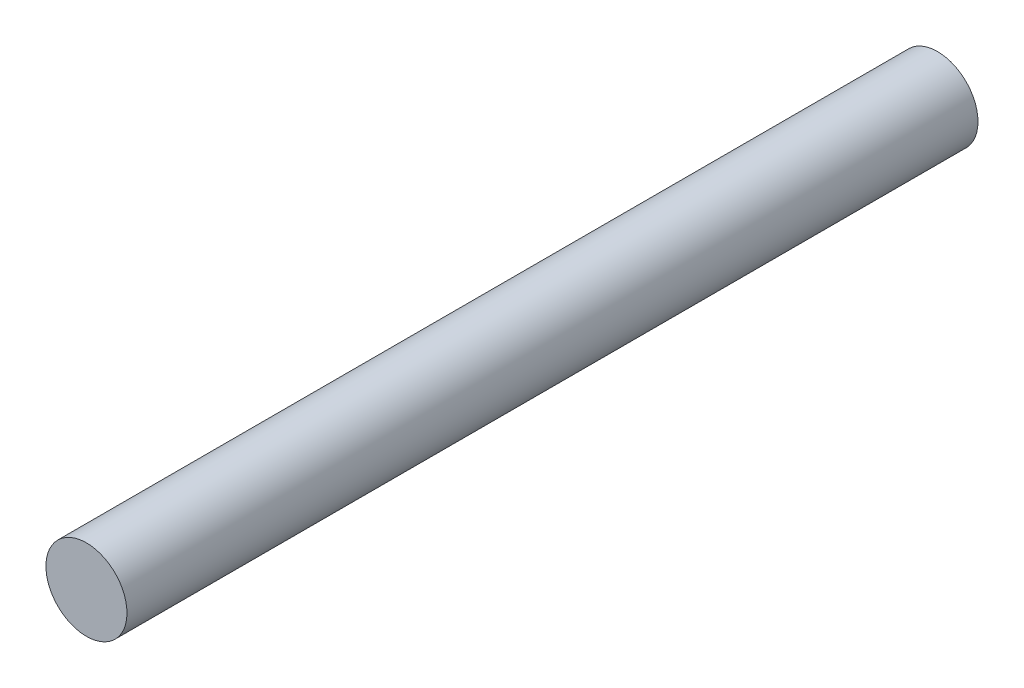
ISO-10303-21;
HEADER;
FILE_DESCRIPTION(('STEP AP214'),'2;1');
FILE_NAME('part.step','',(''),(''),'','','');
FILE_SCHEMA(('AUTOMOTIVE_DESIGN { 1 0 10303 214 1 1 1 1 }'));
ENDSEC;
DATA;
#1=APPLICATION_CONTEXT('core data for automotive mechanical design processes');
#2=APPLICATION_PROTOCOL_DEFINITION('international standard','automotive_design',2000,#1);
#3=PRODUCT_CONTEXT('',#1,'mechanical');
#4=PRODUCT('Part','Part','',(#3));
#5=PRODUCT_RELATED_PRODUCT_CATEGORY('part','',(#4));
#6=PRODUCT_DEFINITION_FORMATION('','',#4);
#7=PRODUCT_DEFINITION_CONTEXT('part definition',#1,'design');
#8=PRODUCT_DEFINITION('design','',#6,#7);
#9=PRODUCT_DEFINITION_SHAPE('','',#8);
#10=(LENGTH_UNIT() NAMED_UNIT(*) SI_UNIT(.MILLI.,.METRE.));
#11=(NAMED_UNIT(*) PLANE_ANGLE_UNIT() SI_UNIT($,.RADIAN.));
#12=(NAMED_UNIT(*) SI_UNIT($,.STERADIAN.) SOLID_ANGLE_UNIT());
#13=UNCERTAINTY_MEASURE_WITH_UNIT(LENGTH_MEASURE(1.E-05),#10,'distance_accuracy_value','');
#14=(GEOMETRIC_REPRESENTATION_CONTEXT(3) GLOBAL_UNCERTAINTY_ASSIGNED_CONTEXT((#13)) GLOBAL_UNIT_ASSIGNED_CONTEXT((#10,
#11,#12)) REPRESENTATION_CONTEXT('',''));
#15=CARTESIAN_POINT('',(0.,0.,0.));
#16=DIRECTION('',(0.,0.,1.));
#17=DIRECTION('',(1.,0.,0.));
#18=AXIS2_PLACEMENT_3D('',#15,#16,#17);
#19=CARTESIAN_POINT('',(0.,0.,53.34));
#20=DIRECTION('',(0.,0.,-1.));
#21=DIRECTION('',(-1.,0.,0.));
#22=AXIS2_PLACEMENT_3D('',#19,#20,#21);
#23=CYLINDRICAL_SURFACE('',#22,2.54);
#24=CARTESIAN_POINT('',(0.,0.,53.34));
#25=DIRECTION('',(0.,0.,1.));
#26=DIRECTION('',(1.,0.,0.));
#27=AXIS2_PLACEMENT_3D('',#24,#25,#26);
#28=CIRCLE('',#27,2.54);
#29=CARTESIAN_POINT('',(2.54,0.,53.34));
#30=VERTEX_POINT('',#29);
#31=EDGE_CURVE('E10',#30,#30,#28,.T.);
#32=ORIENTED_EDGE('',*,*,#31,.F.);
#33=EDGE_LOOP('',(#32));
#34=FACE_BOUND('',#33,.T.);
#35=CARTESIAN_POINT('',(0.,0.,0.));
#36=DIRECTION('',(0.,0.,1.));
#37=DIRECTION('',(1.,0.,0.));
#38=AXIS2_PLACEMENT_3D('',#35,#36,#37);
#39=CIRCLE('',#38,2.54);
#40=CARTESIAN_POINT('',(2.54,0.,0.));
#41=VERTEX_POINT('',#40);
#42=EDGE_CURVE('E37',#41,#41,#39,.T.);
#43=ORIENTED_EDGE('',*,*,#42,.T.);
#44=EDGE_LOOP('',(#43));
#45=FACE_BOUND('',#44,.T.);
#46=ADVANCED_FACE('F34',(#34,#45),#23,.T.);
#47=CARTESIAN_POINT('',(0.,0.,53.34));
#48=DIRECTION('',(0.,0.,1.));
#49=DIRECTION('',(1.,0.,0.));
#50=AXIS2_PLACEMENT_3D('',#47,#48,#49);
#51=PLANE('',#50);
#52=ORIENTED_EDGE('',*,*,#31,.T.);
#53=EDGE_LOOP('',(#52));
#54=FACE_BOUND('',#53,.T.);
#55=ADVANCED_FACE('F49',(#54),#51,.T.);
#56=CARTESIAN_POINT('',(0.,0.,0.));
#57=DIRECTION('',(0.,0.,1.));
#58=DIRECTION('',(1.,0.,0.));
#59=AXIS2_PLACEMENT_3D('',#56,#57,#58);
#60=PLANE('',#59);
#61=ORIENTED_EDGE('',*,*,#42,.F.);
#62=EDGE_LOOP('',(#61));
#63=FACE_BOUND('',#62,.T.);
#64=ADVANCED_FACE('F47',(#63),#60,.F.);
#65=CLOSED_SHELL('',(#46,#55,#64));
#66=MANIFOLD_SOLID_BREP('B2',#65);
#67=ADVANCED_BREP_SHAPE_REPRESENTATION('',(#18,#66),#14);
#68=SHAPE_DEFINITION_REPRESENTATION(#9,#67);
ENDSEC;
END-ISO-10303-21;
